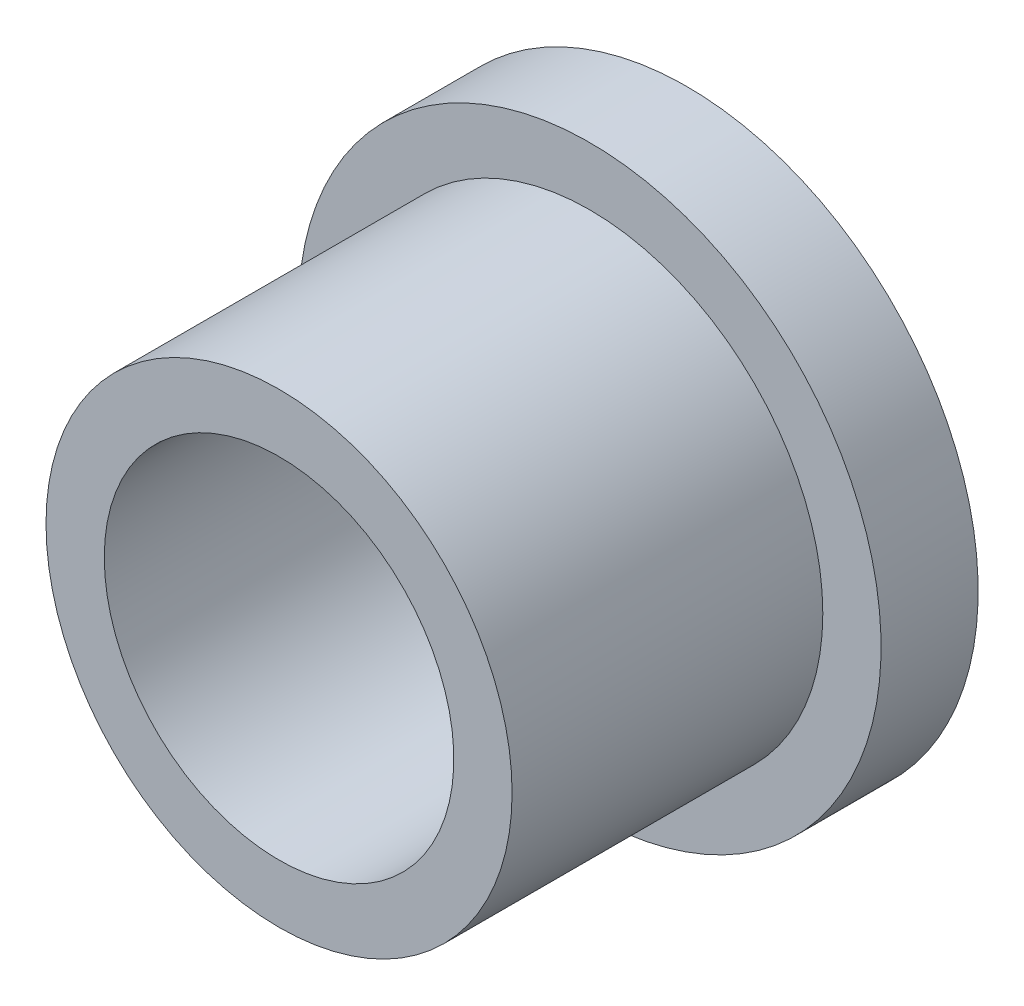
ISO-10303-21;
HEADER;
FILE_DESCRIPTION(('STEP AP214'),'2;1');
FILE_NAME('part.step','',(''),(''),'','','');
FILE_SCHEMA(('AUTOMOTIVE_DESIGN { 1 0 10303 214 1 1 1 1 }'));
ENDSEC;
DATA;
#1=APPLICATION_CONTEXT('core data for automotive mechanical design processes');
#2=APPLICATION_PROTOCOL_DEFINITION('international standard','automotive_design',2000,#1);
#3=PRODUCT_CONTEXT('',#1,'mechanical');
#4=PRODUCT('Part','Part','',(#3));
#5=PRODUCT_RELATED_PRODUCT_CATEGORY('part','',(#4));
#6=PRODUCT_DEFINITION_FORMATION('','',#4);
#7=PRODUCT_DEFINITION_CONTEXT('part definition',#1,'design');
#8=PRODUCT_DEFINITION('design','',#6,#7);
#9=PRODUCT_DEFINITION_SHAPE('','',#8);
#10=(LENGTH_UNIT() NAMED_UNIT(*) SI_UNIT(.MILLI.,.METRE.));
#11=(NAMED_UNIT(*) PLANE_ANGLE_UNIT() SI_UNIT($,.RADIAN.));
#12=(NAMED_UNIT(*) SI_UNIT($,.STERADIAN.) SOLID_ANGLE_UNIT());
#13=UNCERTAINTY_MEASURE_WITH_UNIT(LENGTH_MEASURE(1.E-05),#10,'distance_accuracy_value','');
#14=(GEOMETRIC_REPRESENTATION_CONTEXT(3) GLOBAL_UNCERTAINTY_ASSIGNED_CONTEXT((#13)) GLOBAL_UNIT_ASSIGNED_CONTEXT((#10,
#11,#12)) REPRESENTATION_CONTEXT('',''));
#15=CARTESIAN_POINT('',(0.,0.,0.));
#16=DIRECTION('',(0.,0.,1.));
#17=DIRECTION('',(1.,0.,0.));
#18=AXIS2_PLACEMENT_3D('',#15,#16,#17);
#19=CARTESIAN_POINT('',(0.,0.,5.));
#20=DIRECTION('',(0.,0.,-1.));
#21=DIRECTION('',(-1.,0.,0.));
#22=AXIS2_PLACEMENT_3D('',#19,#20,#21);
#23=CYLINDRICAL_SURFACE('',#22,15.);
#24=CARTESIAN_POINT('',(0.,0.,5.));
#25=DIRECTION('',(0.,0.,1.));
#26=DIRECTION('',(1.,0.,0.));
#27=AXIS2_PLACEMENT_3D('',#24,#25,#26);
#28=CIRCLE('',#27,15.);
#29=CARTESIAN_POINT('',(-15.,0.,5.));
#30=VERTEX_POINT('',#29);
#31=EDGE_CURVE('E12',#30,#30,#28,.T.);
#32=CARTESIAN_POINT('',(0.,0.,0.));
#33=DIRECTION('',(0.,0.,1.));
#34=DIRECTION('',(1.,0.,0.));
#35=AXIS2_PLACEMENT_3D('',#32,#33,#34);
#36=CIRCLE('',#35,15.);
#37=CARTESIAN_POINT('',(-15.,0.,0.));
#38=VERTEX_POINT('',#37);
#39=EDGE_CURVE('E55',#38,#38,#36,.T.);
#40=CARTESIAN_POINT('',(-15.,0.,5.));
#41=CARTESIAN_POINT('',(-15.,0.,4.94791666666667));
#42=CARTESIAN_POINT('',(-15.,0.,4.89583333333334));
#43=CARTESIAN_POINT('',(-15.,0.,4.79166666666667));
#44=CARTESIAN_POINT('',(-15.,0.,4.73958333333334));
#45=CARTESIAN_POINT('',(-15.,0.,4.63541666666667));
#46=CARTESIAN_POINT('',(-15.,0.,4.58333333333334));
#47=CARTESIAN_POINT('',(-15.,0.,4.47916666666667));
#48=CARTESIAN_POINT('',(-15.,0.,4.42708333333334));
#49=CARTESIAN_POINT('',(-15.,0.,4.32291666666667));
#50=CARTESIAN_POINT('',(-15.,0.,4.27083333333334));
#51=CARTESIAN_POINT('',(-15.,0.,4.16666666666667));
#52=CARTESIAN_POINT('',(-15.,0.,4.11458333333334));
#53=CARTESIAN_POINT('',(-15.,0.,4.01041666666667));
#54=CARTESIAN_POINT('',(-15.,0.,3.95833333333334));
#55=CARTESIAN_POINT('',(-15.,0.,3.85416666666667));
#56=CARTESIAN_POINT('',(-15.,0.,3.80208333333334));
#57=CARTESIAN_POINT('',(-15.,0.,3.69791666666667));
#58=CARTESIAN_POINT('',(-15.,0.,3.64583333333334));
#59=CARTESIAN_POINT('',(-15.,0.,3.54166666666667));
#60=CARTESIAN_POINT('',(-15.,0.,3.48958333333334));
#61=CARTESIAN_POINT('',(-15.,0.,3.38541666666667));
#62=CARTESIAN_POINT('',(-15.,0.,3.33333333333334));
#63=CARTESIAN_POINT('',(-15.,0.,3.22916666666667));
#64=CARTESIAN_POINT('',(-15.,0.,3.17708333333334));
#65=CARTESIAN_POINT('',(-15.,0.,3.07291666666667));
#66=CARTESIAN_POINT('',(-15.,0.,3.02083333333334));
#67=CARTESIAN_POINT('',(-15.,0.,2.91666666666667));
#68=CARTESIAN_POINT('',(-15.,0.,2.86458333333334));
#69=CARTESIAN_POINT('',(-15.,0.,2.76041666666667));
#70=CARTESIAN_POINT('',(-15.,0.,2.70833333333334));
#71=CARTESIAN_POINT('',(-15.,0.,2.60416666666667));
#72=CARTESIAN_POINT('',(-15.,0.,2.55208333333334));
#73=CARTESIAN_POINT('',(-15.,0.,2.44791666666667));
#74=CARTESIAN_POINT('',(-15.,0.,2.39583333333334));
#75=CARTESIAN_POINT('',(-15.,0.,2.29166666666667));
#76=CARTESIAN_POINT('',(-15.,0.,2.23958333333334));
#77=CARTESIAN_POINT('',(-15.,0.,2.13541666666667));
#78=CARTESIAN_POINT('',(-15.,0.,2.08333333333334));
#79=CARTESIAN_POINT('',(-15.,0.,1.97916666666667));
#80=CARTESIAN_POINT('',(-15.,0.,1.92708333333334));
#81=CARTESIAN_POINT('',(-15.,0.,1.82291666666667));
#82=CARTESIAN_POINT('',(-15.,0.,1.77083333333334));
#83=CARTESIAN_POINT('',(-15.,0.,1.66666666666667));
#84=CARTESIAN_POINT('',(-15.,0.,1.61458333333334));
#85=CARTESIAN_POINT('',(-15.,0.,1.51041666666667));
#86=CARTESIAN_POINT('',(-15.,0.,1.45833333333334));
#87=CARTESIAN_POINT('',(-15.,0.,1.35416666666667));
#88=CARTESIAN_POINT('',(-15.,0.,1.30208333333334));
#89=CARTESIAN_POINT('',(-15.,0.,1.19791666666667));
#90=CARTESIAN_POINT('',(-15.,0.,1.14583333333333));
#91=CARTESIAN_POINT('',(-15.,0.,1.04166666666667));
#92=CARTESIAN_POINT('',(-15.,0.,0.989583333333334));
#93=CARTESIAN_POINT('',(-15.,0.,0.885416666666668));
#94=CARTESIAN_POINT('',(-15.,0.,0.833333333333334));
#95=CARTESIAN_POINT('',(-15.,0.,0.729166666666667));
#96=CARTESIAN_POINT('',(-15.,0.,0.677083333333334));
#97=CARTESIAN_POINT('',(-15.,0.,0.572916666666667));
#98=CARTESIAN_POINT('',(-15.,0.,0.520833333333334));
#99=CARTESIAN_POINT('',(-15.,0.,0.416666666666667));
#100=CARTESIAN_POINT('',(-15.,0.,0.364583333333334));
#101=CARTESIAN_POINT('',(-15.,0.,0.260416666666667));
#102=CARTESIAN_POINT('',(-15.,0.,0.208333333333334));
#103=CARTESIAN_POINT('',(-15.,0.,0.104166666666667));
#104=CARTESIAN_POINT('',(-15.,0.,0.052083333333334));
#105=CARTESIAN_POINT('',(-15.,0.,0.));
#106=B_SPLINE_CURVE_WITH_KNOTS('',3,(#40,#41,#42,#43,#44,#45,#46,#47,#48,#49,#50,#51,#52,#53,
#54,#55,#56,#57,#58,#59,#60,#61,#62,#63,#64,#65,#66,#67,#68,#69,#70,#71,#72,#73,#74,#75,#76,#77,
#78,#79,#80,#81,#82,#83,#84,#85,#86,#87,#88,#89,#90,#91,#92,#93,#94,#95,#96,#97,#98,#99,#100,
#101,#102,#103,#104,#105),.UNSPECIFIED.,.F.,.F.,(4,2,2,2,2,2,2,2,2,2,2,2,2,2,2,2,2,2,2,2,2,2,2,
2,2,2,2,2,2,2,2,2,4),(0.,0.156249999999999,0.312499999999999,0.46875,0.625,0.78125,0.9375,
1.09375,1.25,1.40625,1.5625,1.71875,1.875,2.03125,2.1875,2.34375,2.5,2.65625,2.8125,2.96875,
3.125,3.28125,3.4375,3.59375,3.75,3.90625,4.0625,4.21875,4.375,4.53125,4.6875,4.84375,5.),.UNSPECIFIED.);
#107=EDGE_CURVE('BSEAM52',#30,#38,#106,.T.);
#108=ORIENTED_EDGE('',*,*,#31,.F.);
#109=ORIENTED_EDGE('',*,*,#39,.T.);
#110=ORIENTED_EDGE('',*,*,#107,.T.);
#111=ORIENTED_EDGE('',*,*,#107,.F.);
#112=EDGE_LOOP('',(#108,#110,#109,#111));
#113=FACE_BOUND('',#112,.T.);
#114=ADVANCED_FACE('F52',(#113),#23,.T.);
#115=CARTESIAN_POINT('',(0.,0.,5.));
#116=DIRECTION('',(0.,0.,1.));
#117=DIRECTION('',(1.,0.,0.));
#118=AXIS2_PLACEMENT_3D('',#115,#116,#117);
#119=PLANE('',#118);
#120=CARTESIAN_POINT('',(0.,0.,5.));
#121=DIRECTION('',(0.,0.,1.));
#122=DIRECTION('',(1.,0.,0.));
#123=AXIS2_PLACEMENT_3D('',#120,#121,#122);
#124=CIRCLE('',#123,12.);
#125=CARTESIAN_POINT('',(-12.,0.,5.00000000000001));
#126=VERTEX_POINT('',#125);
#127=EDGE_CURVE('E59',#126,#126,#124,.T.);
#128=ORIENTED_EDGE('',*,*,#127,.F.);
#129=EDGE_LOOP('',(#128));
#130=FACE_BOUND('',#129,.T.);
#131=ORIENTED_EDGE('',*,*,#31,.T.);
#132=EDGE_LOOP('',(#131));
#133=FACE_BOUND('',#132,.T.);
#134=ADVANCED_FACE('F94',(#130,#133),#119,.T.);
#135=CARTESIAN_POINT('',(0.,0.,0.));
#136=DIRECTION('',(0.,0.,1.));
#137=DIRECTION('',(1.,0.,0.));
#138=AXIS2_PLACEMENT_3D('',#135,#136,#137);
#139=PLANE('',#138);
#140=ORIENTED_EDGE('',*,*,#39,.F.);
#141=EDGE_LOOP('',(#140));
#142=FACE_BOUND('',#141,.T.);
#143=CARTESIAN_POINT('',(0.,0.,0.));
#144=DIRECTION('',(0.,0.,1.));
#145=DIRECTION('',(1.,0.,0.));
#146=AXIS2_PLACEMENT_3D('',#143,#144,#145);
#147=CIRCLE('',#146,9.);
#148=CARTESIAN_POINT('',(-8.99999999999999,0.,0.));
#149=VERTEX_POINT('',#148);
#150=EDGE_CURVE('E65',#149,#149,#147,.T.);
#151=ORIENTED_EDGE('',*,*,#150,.T.);
#152=EDGE_LOOP('',(#151));
#153=FACE_BOUND('',#152,.T.);
#154=ADVANCED_FACE('F91',(#142,#153),#139,.F.);
#155=CARTESIAN_POINT('',(0.,0.,21.));
#156=DIRECTION('',(0.,0.,-0.999999999999999));
#157=DIRECTION('',(-1.,0.,0.));
#158=AXIS2_PLACEMENT_3D('',#155,#156,#157);
#159=CYLINDRICAL_SURFACE('',#158,9.);
#160=CARTESIAN_POINT('',(0.,0.,21.));
#161=DIRECTION('',(0.,0.,1.));
#162=DIRECTION('',(1.,0.,0.));
#163=AXIS2_PLACEMENT_3D('',#160,#161,#162);
#164=CIRCLE('',#163,9.);
#165=CARTESIAN_POINT('',(-8.99999999999999,0.,21.));
#166=VERTEX_POINT('',#165);
#167=EDGE_CURVE('E68',#166,#166,#164,.T.);
#168=CARTESIAN_POINT('',(-8.99999999999999,0.,21.));
#169=CARTESIAN_POINT('',(-8.99999999999999,0.,20.78125));
#170=CARTESIAN_POINT('',(-8.99999999999999,0.,20.5625));
#171=CARTESIAN_POINT('',(-8.99999999999999,0.,20.125));
#172=CARTESIAN_POINT('',(-8.99999999999999,0.,19.90625));
#173=CARTESIAN_POINT('',(-8.99999999999999,0.,19.46875));
#174=CARTESIAN_POINT('',(-8.99999999999999,0.,19.25));
#175=CARTESIAN_POINT('',(-8.99999999999999,0.,18.8125));
#176=CARTESIAN_POINT('',(-8.99999999999999,0.,18.59375));
#177=CARTESIAN_POINT('',(-8.99999999999999,0.,18.15625));
#178=CARTESIAN_POINT('',(-8.99999999999999,0.,17.9375));
#179=CARTESIAN_POINT('',(-8.99999999999999,0.,17.5));
#180=CARTESIAN_POINT('',(-8.99999999999999,0.,17.28125));
#181=CARTESIAN_POINT('',(-8.99999999999999,0.,16.84375));
#182=CARTESIAN_POINT('',(-8.99999999999999,0.,16.625));
#183=CARTESIAN_POINT('',(-8.99999999999999,0.,16.1875));
#184=CARTESIAN_POINT('',(-8.99999999999999,0.,15.96875));
#185=CARTESIAN_POINT('',(-8.99999999999999,0.,15.53125));
#186=CARTESIAN_POINT('',(-8.99999999999999,0.,15.3125));
#187=CARTESIAN_POINT('',(-8.99999999999999,0.,14.875));
#188=CARTESIAN_POINT('',(-8.99999999999999,0.,14.65625));
#189=CARTESIAN_POINT('',(-8.99999999999999,0.,14.21875));
#190=CARTESIAN_POINT('',(-8.99999999999999,0.,14.));
#191=CARTESIAN_POINT('',(-8.99999999999999,0.,13.5625));
#192=CARTESIAN_POINT('',(-8.99999999999999,0.,13.34375));
#193=CARTESIAN_POINT('',(-8.99999999999999,0.,12.90625));
#194=CARTESIAN_POINT('',(-8.99999999999999,0.,12.6875));
#195=CARTESIAN_POINT('',(-8.99999999999999,0.,12.25));
#196=CARTESIAN_POINT('',(-8.99999999999999,0.,12.03125));
#197=CARTESIAN_POINT('',(-8.99999999999999,0.,11.59375));
#198=CARTESIAN_POINT('',(-8.99999999999999,0.,11.375));
#199=CARTESIAN_POINT('',(-8.99999999999999,0.,10.9375));
#200=CARTESIAN_POINT('',(-8.99999999999999,0.,10.71875));
#201=CARTESIAN_POINT('',(-8.99999999999999,0.,10.28125));
#202=CARTESIAN_POINT('',(-8.99999999999999,0.,10.0625));
#203=CARTESIAN_POINT('',(-8.99999999999999,0.,9.62500000000001));
#204=CARTESIAN_POINT('',(-8.99999999999999,0.,9.40625000000001));
#205=CARTESIAN_POINT('',(-8.99999999999999,0.,8.96875000000001));
#206=CARTESIAN_POINT('',(-8.99999999999999,0.,8.75000000000001));
#207=CARTESIAN_POINT('',(-8.99999999999999,0.,8.31250000000001));
#208=CARTESIAN_POINT('',(-8.99999999999999,0.,8.09375000000001));
#209=CARTESIAN_POINT('',(-8.99999999999999,0.,7.65625000000001));
#210=CARTESIAN_POINT('',(-8.99999999999999,0.,7.43750000000001));
#211=CARTESIAN_POINT('',(-8.99999999999999,0.,7.00000000000001));
#212=CARTESIAN_POINT('',(-8.99999999999999,0.,6.78125000000001));
#213=CARTESIAN_POINT('',(-8.99999999999999,0.,6.34375000000001));
#214=CARTESIAN_POINT('',(-8.99999999999999,0.,6.12500000000001));
#215=CARTESIAN_POINT('',(-8.99999999999999,0.,5.68750000000001));
#216=CARTESIAN_POINT('',(-8.99999999999999,0.,5.46875000000001));
#217=CARTESIAN_POINT('',(-8.99999999999999,0.,5.03125000000001));
#218=CARTESIAN_POINT('',(-8.99999999999999,0.,4.81250000000001));
#219=CARTESIAN_POINT('',(-8.99999999999999,0.,4.37500000000001));
#220=CARTESIAN_POINT('',(-8.99999999999999,0.,4.15625000000001));
#221=CARTESIAN_POINT('',(-8.99999999999999,0.,3.71875000000001));
#222=CARTESIAN_POINT('',(-8.99999999999999,0.,3.50000000000001));
#223=CARTESIAN_POINT('',(-8.99999999999999,0.,3.06250000000001));
#224=CARTESIAN_POINT('',(-8.99999999999999,0.,2.84375000000001));
#225=CARTESIAN_POINT('',(-8.99999999999999,0.,2.40625000000001));
#226=CARTESIAN_POINT('',(-8.99999999999999,0.,2.18750000000001));
#227=CARTESIAN_POINT('',(-8.99999999999999,0.,1.75000000000001));
#228=CARTESIAN_POINT('',(-8.99999999999999,0.,1.53125));
#229=CARTESIAN_POINT('',(-8.99999999999999,0.,1.09375));
#230=CARTESIAN_POINT('',(-8.99999999999999,0.,0.875000000000004));
#231=CARTESIAN_POINT('',(-8.99999999999999,0.,0.437500000000004));
#232=CARTESIAN_POINT('',(-8.99999999999999,0.,0.218750000000003));
#233=CARTESIAN_POINT('',(-8.99999999999999,0.,0.));
#234=B_SPLINE_CURVE_WITH_KNOTS('',3,(#168,#169,#170,#171,#172,#173,#174,#175,#176,#177,#178,
#179,#180,#181,#182,#183,#184,#185,#186,#187,#188,#189,#190,#191,#192,#193,#194,#195,#196,#197,
#198,#199,#200,#201,#202,#203,#204,#205,#206,#207,#208,#209,#210,#211,#212,#213,#214,#215,#216,
#217,#218,#219,#220,#221,#222,#223,#224,#225,#226,#227,#228,#229,#230,#231,#232,#233),
.UNSPECIFIED.,.F.,.F.,(4,2,2,2,2,2,2,2,2,2,2,2,2,2,2,2,2,2,2,2,2,2,2,2,2,2,2,2,2,2,2,2,4),(0.,
0.656249999999997,1.3125,1.96875,2.625,3.28125,3.9375,4.59375,5.25,5.90625,6.5625,7.21875,7.875,
8.53125,9.1875,9.84375,10.5,11.15625,11.8125,12.46875,13.125,13.78125,14.4375,15.09375,15.75,
16.40625,17.0625,17.71875,18.375,19.03125,19.6875,20.34375,21.),.UNSPECIFIED.);
#235=EDGE_CURVE('BSEAM75',#166,#149,#234,.T.);
#236=ORIENTED_EDGE('',*,*,#167,.T.);
#237=ORIENTED_EDGE('',*,*,#150,.F.);
#238=ORIENTED_EDGE('',*,*,#235,.T.);
#239=ORIENTED_EDGE('',*,*,#235,.F.);
#240=EDGE_LOOP('',(#236,#238,#237,#239));
#241=FACE_BOUND('',#240,.T.);
#242=ADVANCED_FACE('F75',(#241),#159,.F.);
#243=CARTESIAN_POINT('',(0.,0.,21.));
#244=DIRECTION('',(0.,0.,-0.999999999999999));
#245=DIRECTION('',(-1.,0.,0.));
#246=AXIS2_PLACEMENT_3D('',#243,#244,#245);
#247=CYLINDRICAL_SURFACE('',#246,12.);
#248=CARTESIAN_POINT('',(0.,0.,21.));
#249=DIRECTION('',(0.,0.,1.));
#250=DIRECTION('',(1.,0.,0.));
#251=AXIS2_PLACEMENT_3D('',#248,#249,#250);
#252=CIRCLE('',#251,12.);
#253=CARTESIAN_POINT('',(-12.,0.,21.));
#254=VERTEX_POINT('',#253);
#255=EDGE_CURVE('E69',#254,#254,#252,.T.);
#256=CARTESIAN_POINT('',(-12.,0.,5.00000000000001));
#257=CARTESIAN_POINT('',(-12.,0.,5.16666666666667));
#258=CARTESIAN_POINT('',(-12.,0.,5.33333333333334));
#259=CARTESIAN_POINT('',(-12.,0.,5.66666666666667));
#260=CARTESIAN_POINT('',(-12.,0.,5.83333333333334));
#261=CARTESIAN_POINT('',(-12.,0.,6.16666666666667));
#262=CARTESIAN_POINT('',(-12.,0.,6.33333333333334));
#263=CARTESIAN_POINT('',(-12.,0.,6.66666666666667));
#264=CARTESIAN_POINT('',(-12.,0.,6.83333333333334));
#265=CARTESIAN_POINT('',(-12.,0.,7.16666666666667));
#266=CARTESIAN_POINT('',(-12.,0.,7.33333333333334));
#267=CARTESIAN_POINT('',(-12.,0.,7.66666666666667));
#268=CARTESIAN_POINT('',(-12.,0.,7.83333333333334));
#269=CARTESIAN_POINT('',(-12.,0.,8.16666666666667));
#270=CARTESIAN_POINT('',(-12.,0.,8.33333333333334));
#271=CARTESIAN_POINT('',(-12.,0.,8.66666666666667));
#272=CARTESIAN_POINT('',(-12.,0.,8.83333333333334));
#273=CARTESIAN_POINT('',(-12.,0.,9.16666666666667));
#274=CARTESIAN_POINT('',(-12.,0.,9.33333333333334));
#275=CARTESIAN_POINT('',(-12.,0.,9.66666666666667));
#276=CARTESIAN_POINT('',(-12.,0.,9.83333333333334));
#277=CARTESIAN_POINT('',(-12.,0.,10.1666666666667));
#278=CARTESIAN_POINT('',(-12.,0.,10.3333333333333));
#279=CARTESIAN_POINT('',(-12.,0.,10.6666666666667));
#280=CARTESIAN_POINT('',(-12.,0.,10.8333333333333));
#281=CARTESIAN_POINT('',(-12.,0.,11.1666666666667));
#282=CARTESIAN_POINT('',(-12.,0.,11.3333333333333));
#283=CARTESIAN_POINT('',(-12.,0.,11.6666666666667));
#284=CARTESIAN_POINT('',(-12.,0.,11.8333333333333));
#285=CARTESIAN_POINT('',(-12.,0.,12.1666666666667));
#286=CARTESIAN_POINT('',(-12.,0.,12.3333333333333));
#287=CARTESIAN_POINT('',(-12.,0.,12.6666666666667));
#288=CARTESIAN_POINT('',(-12.,0.,12.8333333333333));
#289=CARTESIAN_POINT('',(-12.,0.,13.1666666666667));
#290=CARTESIAN_POINT('',(-12.,0.,13.3333333333333));
#291=CARTESIAN_POINT('',(-12.,0.,13.6666666666667));
#292=CARTESIAN_POINT('',(-12.,0.,13.8333333333333));
#293=CARTESIAN_POINT('',(-12.,0.,14.1666666666667));
#294=CARTESIAN_POINT('',(-12.,0.,14.3333333333333));
#295=CARTESIAN_POINT('',(-12.,0.,14.6666666666667));
#296=CARTESIAN_POINT('',(-12.,0.,14.8333333333333));
#297=CARTESIAN_POINT('',(-12.,0.,15.1666666666667));
#298=CARTESIAN_POINT('',(-12.,0.,15.3333333333333));
#299=CARTESIAN_POINT('',(-12.,0.,15.6666666666667));
#300=CARTESIAN_POINT('',(-12.,0.,15.8333333333333));
#301=CARTESIAN_POINT('',(-12.,0.,16.1666666666667));
#302=CARTESIAN_POINT('',(-12.,0.,16.3333333333333));
#303=CARTESIAN_POINT('',(-12.,0.,16.6666666666667));
#304=CARTESIAN_POINT('',(-12.,0.,16.8333333333333));
#305=CARTESIAN_POINT('',(-12.,0.,17.1666666666667));
#306=CARTESIAN_POINT('',(-12.,0.,17.3333333333333));
#307=CARTESIAN_POINT('',(-12.,0.,17.6666666666667));
#308=CARTESIAN_POINT('',(-12.,0.,17.8333333333333));
#309=CARTESIAN_POINT('',(-12.,0.,18.1666666666667));
#310=CARTESIAN_POINT('',(-12.,0.,18.3333333333333));
#311=CARTESIAN_POINT('',(-12.,0.,18.6666666666667));
#312=CARTESIAN_POINT('',(-12.,0.,18.8333333333333));
#313=CARTESIAN_POINT('',(-12.,0.,19.1666666666667));
#314=CARTESIAN_POINT('',(-12.,0.,19.3333333333333));
#315=CARTESIAN_POINT('',(-12.,0.,19.6666666666667));
#316=CARTESIAN_POINT('',(-12.,0.,19.8333333333333));
#317=CARTESIAN_POINT('',(-12.,0.,20.1666666666667));
#318=CARTESIAN_POINT('',(-12.,0.,20.3333333333333));
#319=CARTESIAN_POINT('',(-12.,0.,20.6666666666667));
#320=CARTESIAN_POINT('',(-12.,0.,20.8333333333333));
#321=CARTESIAN_POINT('',(-12.,0.,21.));
#322=B_SPLINE_CURVE_WITH_KNOTS('',3,(#256,#257,#258,#259,#260,#261,#262,#263,#264,#265,#266,
#267,#268,#269,#270,#271,#272,#273,#274,#275,#276,#277,#278,#279,#280,#281,#282,#283,#284,#285,
#286,#287,#288,#289,#290,#291,#292,#293,#294,#295,#296,#297,#298,#299,#300,#301,#302,#303,#304,
#305,#306,#307,#308,#309,#310,#311,#312,#313,#314,#315,#316,#317,#318,#319,#320,#321),
.UNSPECIFIED.,.F.,.F.,(4,2,2,2,2,2,2,2,2,2,2,2,2,2,2,2,2,2,2,2,2,2,2,2,2,2,2,2,2,2,2,2,4),(0.,
0.499999999999999,0.999999999999999,1.5,2.,2.5,3.,3.5,4.,4.5,5.,5.5,6.,6.5,7.,7.5,8.,8.5,9.,9.5,
10.,10.5,11.,11.5,12.,12.5,13.,13.5,14.,14.5,15.,15.5,16.),.UNSPECIFIED.);
#323=EDGE_CURVE('BSEAM81',#126,#254,#322,.T.);
#324=ORIENTED_EDGE('',*,*,#127,.T.);
#325=ORIENTED_EDGE('',*,*,#255,.F.);
#326=ORIENTED_EDGE('',*,*,#323,.T.);
#327=ORIENTED_EDGE('',*,*,#323,.F.);
#328=EDGE_LOOP('',(#324,#326,#325,#327));
#329=FACE_BOUND('',#328,.T.);
#330=ADVANCED_FACE('F81',(#329),#247,.T.);
#331=CARTESIAN_POINT('',(0.,0.,21.));
#332=DIRECTION('',(0.,0.,1.));
#333=DIRECTION('',(1.,0.,0.));
#334=AXIS2_PLACEMENT_3D('',#331,#332,#333);
#335=PLANE('',#334);
#336=ORIENTED_EDGE('',*,*,#167,.F.);
#337=EDGE_LOOP('',(#336));
#338=FACE_BOUND('',#337,.T.);
#339=ORIENTED_EDGE('',*,*,#255,.T.);
#340=EDGE_LOOP('',(#339));
#341=FACE_BOUND('',#340,.T.);
#342=ADVANCED_FACE('F78',(#338,#341),#335,.T.);
#343=CLOSED_SHELL('',(#114,#134,#154,#242,#330,#342));
#344=MANIFOLD_SOLID_BREP('B2',#343);
#345=ADVANCED_BREP_SHAPE_REPRESENTATION('',(#18,#344),#14);
#346=SHAPE_DEFINITION_REPRESENTATION(#9,#345);
ENDSEC;
END-ISO-10303-21;
